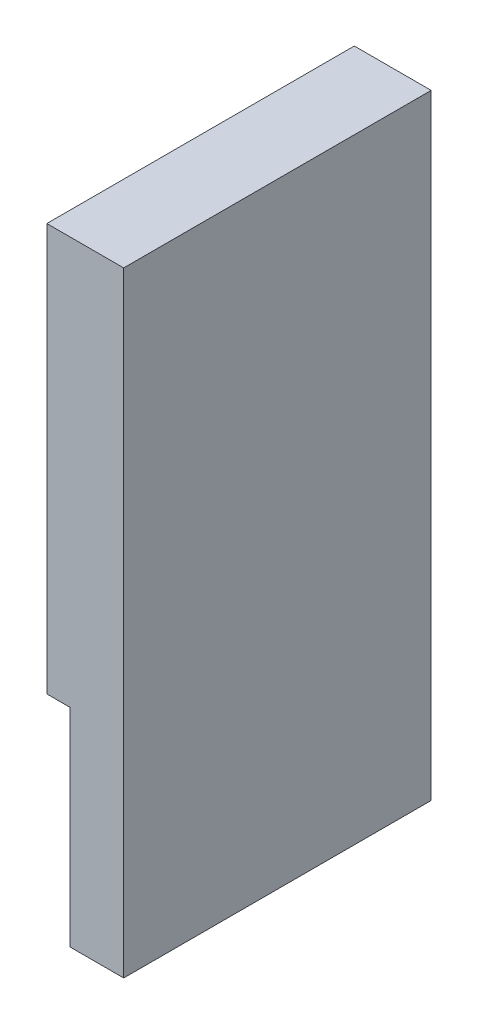
ISO-10303-21;
HEADER;
FILE_DESCRIPTION(('STEP AP214'),'2;1');
FILE_NAME('part.step','',(''),(''),'','','');
FILE_SCHEMA(('AUTOMOTIVE_DESIGN { 1 0 10303 214 1 1 1 1 }'));
ENDSEC;
DATA;
#1=APPLICATION_CONTEXT('core data for automotive mechanical design processes');
#2=APPLICATION_PROTOCOL_DEFINITION('international standard','automotive_design',2000,#1);
#3=PRODUCT_CONTEXT('',#1,'mechanical');
#4=PRODUCT('Part','Part','',(#3));
#5=PRODUCT_RELATED_PRODUCT_CATEGORY('part','',(#4));
#6=PRODUCT_DEFINITION_FORMATION('','',#4);
#7=PRODUCT_DEFINITION_CONTEXT('part definition',#1,'design');
#8=PRODUCT_DEFINITION('design','',#6,#7);
#9=PRODUCT_DEFINITION_SHAPE('','',#8);
#10=(LENGTH_UNIT() NAMED_UNIT(*) SI_UNIT(.MILLI.,.METRE.));
#11=(NAMED_UNIT(*) PLANE_ANGLE_UNIT() SI_UNIT($,.RADIAN.));
#12=(NAMED_UNIT(*) SI_UNIT($,.STERADIAN.) SOLID_ANGLE_UNIT());
#13=UNCERTAINTY_MEASURE_WITH_UNIT(LENGTH_MEASURE(1.E-05),#10,'distance_accuracy_value','');
#14=(GEOMETRIC_REPRESENTATION_CONTEXT(3) GLOBAL_UNCERTAINTY_ASSIGNED_CONTEXT((#13)) GLOBAL_UNIT_ASSIGNED_CONTEXT((#10,
#11,#12)) REPRESENTATION_CONTEXT('',''));
#15=CARTESIAN_POINT('',(0.,0.,0.));
#16=DIRECTION('',(0.,0.,1.));
#17=DIRECTION('',(1.,0.,0.));
#18=AXIS2_PLACEMENT_3D('',#15,#16,#17);
#19=CARTESIAN_POINT('',(10.,1.83908045977011,0.));
#20=DIRECTION('',(0.,1.,0.));
#21=DIRECTION('',(0.,0.,1.));
#22=AXIS2_PLACEMENT_3D('',#19,#20,#21);
#23=PLANE('',#22);
#24=DIRECTION('',(0.,0.,1.));
#25=VECTOR('',#24,1.);
#26=CARTESIAN_POINT('',(3.,1.83908045977011,-40.));
#27=LINE('',#26,#25);
#28=CARTESIAN_POINT('',(3.,1.83908045977011,-40.));
#29=VERTEX_POINT('',#28);
#30=CARTESIAN_POINT('',(3.,1.83908045977011,0.));
#31=VERTEX_POINT('',#30);
#32=EDGE_CURVE('E103',#29,#31,#27,.T.);
#33=ORIENTED_EDGE('',*,*,#32,.F.);
#34=DIRECTION('',(-1.,0.,0.));
#35=VECTOR('',#34,1.);
#36=CARTESIAN_POINT('',(10.,1.83908045977011,-40.));
#37=LINE('',#36,#35);
#38=CARTESIAN_POINT('',(10.,1.83908045977011,-40.));
#39=VERTEX_POINT('',#38);
#40=EDGE_CURVE('E45',#39,#29,#37,.T.);
#41=ORIENTED_EDGE('',*,*,#40,.F.);
#42=DIRECTION('',(0.,0.,-1.));
#43=VECTOR('',#42,1.);
#44=CARTESIAN_POINT('',(10.,1.83908045977011,0.));
#45=LINE('',#44,#43);
#46=CARTESIAN_POINT('',(10.,1.83908045977011,0.));
#47=VERTEX_POINT('',#46);
#48=EDGE_CURVE('E83',#47,#39,#45,.T.);
#49=ORIENTED_EDGE('',*,*,#48,.F.);
#50=DIRECTION('',(-1.,0.,0.));
#51=VECTOR('',#50,1.);
#52=CARTESIAN_POINT('',(10.,1.83908045977011,0.));
#53=LINE('',#52,#51);
#54=EDGE_CURVE('E11',#47,#31,#53,.T.);
#55=ORIENTED_EDGE('',*,*,#54,.T.);
#56=EDGE_LOOP('',(#33,#41,#49,#55));
#57=FACE_BOUND('',#56,.T.);
#58=ADVANCED_FACE('F37',(#57),#23,.F.);
#59=CARTESIAN_POINT('',(10.,81.8390804597701,0.));
#60=DIRECTION('',(0.,0.,-1.));
#61=DIRECTION('',(0.,1.,0.));
#62=AXIS2_PLACEMENT_3D('',#59,#60,#61);
#63=PLANE('',#62);
#64=DIRECTION('',(0.,-1.,0.));
#65=VECTOR('',#64,1.);
#66=CARTESIAN_POINT('',(0.,81.8390804597701,0.));
#67=LINE('',#66,#65);
#68=CARTESIAN_POINT('',(0.,81.8390804597701,0.));
#69=VERTEX_POINT('',#68);
#70=CARTESIAN_POINT('',(0.,28.8390804597701,0.));
#71=VERTEX_POINT('',#70);
#72=EDGE_CURVE('E127',#69,#71,#67,.T.);
#73=ORIENTED_EDGE('',*,*,#72,.T.);
#74=DIRECTION('',(-1.,0.,0.));
#75=VECTOR('',#74,1.);
#76=CARTESIAN_POINT('',(3.,28.8390804597701,0.));
#77=LINE('',#76,#75);
#78=CARTESIAN_POINT('',(3.,28.8390804597701,0.));
#79=VERTEX_POINT('',#78);
#80=EDGE_CURVE('E52',#79,#71,#77,.T.);
#81=ORIENTED_EDGE('',*,*,#80,.F.);
#82=DIRECTION('',(0.,1.,0.));
#83=VECTOR('',#82,1.);
#84=CARTESIAN_POINT('',(3.,28.8390804597701,0.));
#85=LINE('',#84,#83);
#86=EDGE_CURVE('E113',#31,#79,#85,.T.);
#87=ORIENTED_EDGE('',*,*,#86,.F.);
#88=ORIENTED_EDGE('',*,*,#54,.F.);
#89=DIRECTION('',(0.,-1.,0.));
#90=VECTOR('',#89,1.);
#91=CARTESIAN_POINT('',(10.,81.8390804597701,0.));
#92=LINE('',#91,#90);
#93=CARTESIAN_POINT('',(10.,81.8390804597701,0.));
#94=VERTEX_POINT('',#93);
#95=EDGE_CURVE('E124',#94,#47,#92,.T.);
#96=ORIENTED_EDGE('',*,*,#95,.F.);
#97=DIRECTION('',(-1.,0.,0.));
#98=VECTOR('',#97,1.);
#99=CARTESIAN_POINT('',(10.,81.8390804597701,0.));
#100=LINE('',#99,#98);
#101=EDGE_CURVE('E119',#94,#69,#100,.T.);
#102=ORIENTED_EDGE('',*,*,#101,.T.);
#103=EDGE_LOOP('',(#73,#81,#87,#88,#96,#102));
#104=FACE_BOUND('',#103,.T.);
#105=ADVANCED_FACE('F39',(#104),#63,.F.);
#106=CARTESIAN_POINT('',(10.,81.8390804597701,-40.));
#107=DIRECTION('',(0.,0.,1.));
#108=DIRECTION('',(1.,0.,0.));
#109=AXIS2_PLACEMENT_3D('',#106,#107,#108);
#110=PLANE('',#109);
#111=DIRECTION('',(0.,-1.,0.));
#112=VECTOR('',#111,1.);
#113=CARTESIAN_POINT('',(3.,28.8390804597701,-40.));
#114=LINE('',#113,#112);
#115=CARTESIAN_POINT('',(3.,28.8390804597701,-40.));
#116=VERTEX_POINT('',#115);
#117=EDGE_CURVE('E100',#116,#29,#114,.T.);
#118=ORIENTED_EDGE('',*,*,#117,.F.);
#119=DIRECTION('',(-1.,0.,0.));
#120=VECTOR('',#119,1.);
#121=CARTESIAN_POINT('',(3.,28.8390804597701,-40.));
#122=LINE('',#121,#120);
#123=CARTESIAN_POINT('',(0.,28.8390804597701,-40.));
#124=VERTEX_POINT('',#123);
#125=EDGE_CURVE('E130',#116,#124,#122,.T.);
#126=ORIENTED_EDGE('',*,*,#125,.T.);
#127=DIRECTION('',(0.,1.,0.));
#128=VECTOR('',#127,1.);
#129=CARTESIAN_POINT('',(0.,81.8390804597701,-40.));
#130=LINE('',#129,#128);
#131=CARTESIAN_POINT('',(0.,81.8390804597701,-40.));
#132=VERTEX_POINT('',#131);
#133=EDGE_CURVE('E125',#124,#132,#130,.T.);
#134=ORIENTED_EDGE('',*,*,#133,.T.);
#135=DIRECTION('',(-1.,0.,0.));
#136=VECTOR('',#135,1.);
#137=CARTESIAN_POINT('',(10.,81.8390804597701,-40.));
#138=LINE('',#137,#136);
#139=CARTESIAN_POINT('',(10.,81.8390804597701,-40.));
#140=VERTEX_POINT('',#139);
#141=EDGE_CURVE('E118',#140,#132,#138,.T.);
#142=ORIENTED_EDGE('',*,*,#141,.F.);
#143=DIRECTION('',(0.,1.,0.));
#144=VECTOR('',#143,1.);
#145=CARTESIAN_POINT('',(10.,81.8390804597701,-40.));
#146=LINE('',#145,#144);
#147=EDGE_CURVE('E117',#39,#140,#146,.T.);
#148=ORIENTED_EDGE('',*,*,#147,.F.);
#149=ORIENTED_EDGE('',*,*,#40,.T.);
#150=EDGE_LOOP('',(#118,#126,#134,#142,#148,#149));
#151=FACE_BOUND('',#150,.T.);
#152=ADVANCED_FACE('F115',(#151),#110,.F.);
#153=CARTESIAN_POINT('',(10.,81.8390804597701,0.));
#154=DIRECTION('',(0.,-1.,0.));
#155=DIRECTION('',(0.,0.,-1.));
#156=AXIS2_PLACEMENT_3D('',#153,#154,#155);
#157=PLANE('',#156);
#158=DIRECTION('',(0.,0.,1.));
#159=VECTOR('',#158,1.);
#160=CARTESIAN_POINT('',(0.,81.8390804597701,0.));
#161=LINE('',#160,#159);
#162=EDGE_CURVE('E76',#132,#69,#161,.T.);
#163=ORIENTED_EDGE('',*,*,#162,.T.);
#164=ORIENTED_EDGE('',*,*,#101,.F.);
#165=DIRECTION('',(0.,0.,1.));
#166=VECTOR('',#165,1.);
#167=CARTESIAN_POINT('',(10.,81.8390804597701,0.));
#168=LINE('',#167,#166);
#169=EDGE_CURVE('E61',#140,#94,#168,.T.);
#170=ORIENTED_EDGE('',*,*,#169,.F.);
#171=ORIENTED_EDGE('',*,*,#141,.T.);
#172=EDGE_LOOP('',(#163,#164,#170,#171));
#173=FACE_BOUND('',#172,.T.);
#174=ADVANCED_FACE('F146',(#173),#157,.F.);
#175=CARTESIAN_POINT('',(10.,0.,0.));
#176=DIRECTION('',(1.,0.,0.));
#177=DIRECTION('',(0.,0.,-1.));
#178=AXIS2_PLACEMENT_3D('',#175,#176,#177);
#179=PLANE('',#178);
#180=ORIENTED_EDGE('',*,*,#95,.T.);
#181=ORIENTED_EDGE('',*,*,#48,.T.);
#182=ORIENTED_EDGE('',*,*,#147,.T.);
#183=ORIENTED_EDGE('',*,*,#169,.T.);
#184=EDGE_LOOP('',(#180,#181,#182,#183));
#185=FACE_BOUND('',#184,.T.);
#186=ADVANCED_FACE('F147',(#185),#179,.T.);
#187=CARTESIAN_POINT('',(0.,0.,0.));
#188=DIRECTION('',(1.,0.,0.));
#189=DIRECTION('',(0.,0.,-1.));
#190=AXIS2_PLACEMENT_3D('',#187,#188,#189);
#191=PLANE('',#190);
#192=ORIENTED_EDGE('',*,*,#133,.F.);
#193=DIRECTION('',(0.,0.,-1.));
#194=VECTOR('',#193,1.);
#195=CARTESIAN_POINT('',(0.,28.8390804597701,-40.));
#196=LINE('',#195,#194);
#197=EDGE_CURVE('E109',#71,#124,#196,.T.);
#198=ORIENTED_EDGE('',*,*,#197,.F.);
#199=ORIENTED_EDGE('',*,*,#72,.F.);
#200=ORIENTED_EDGE('',*,*,#162,.F.);
#201=EDGE_LOOP('',(#192,#198,#199,#200));
#202=FACE_BOUND('',#201,.T.);
#203=ADVANCED_FACE('F145',(#202),#191,.F.);
#204=CARTESIAN_POINT('',(3.,28.8390804597701,-40.));
#205=DIRECTION('',(0.,1.,0.));
#206=DIRECTION('',(0.,0.,1.));
#207=AXIS2_PLACEMENT_3D('',#204,#205,#206);
#208=PLANE('',#207);
#209=ORIENTED_EDGE('',*,*,#197,.T.);
#210=ORIENTED_EDGE('',*,*,#125,.F.);
#211=DIRECTION('',(0.,0.,-1.));
#212=VECTOR('',#211,1.);
#213=CARTESIAN_POINT('',(3.,28.8390804597701,-40.));
#214=LINE('',#213,#212);
#215=EDGE_CURVE('E105',#79,#116,#214,.T.);
#216=ORIENTED_EDGE('',*,*,#215,.F.);
#217=ORIENTED_EDGE('',*,*,#80,.T.);
#218=EDGE_LOOP('',(#209,#210,#216,#217));
#219=FACE_BOUND('',#218,.T.);
#220=ADVANCED_FACE('F140',(#219),#208,.F.);
#221=CARTESIAN_POINT('',(3.,0.,0.));
#222=DIRECTION('',(-1.,0.,0.));
#223=DIRECTION('',(0.,0.,1.));
#224=AXIS2_PLACEMENT_3D('',#221,#222,#223);
#225=PLANE('',#224);
#226=ORIENTED_EDGE('',*,*,#117,.T.);
#227=ORIENTED_EDGE('',*,*,#32,.T.);
#228=ORIENTED_EDGE('',*,*,#86,.T.);
#229=ORIENTED_EDGE('',*,*,#215,.T.);
#230=EDGE_LOOP('',(#226,#227,#228,#229));
#231=FACE_BOUND('',#230,.T.);
#232=ADVANCED_FACE('F102',(#231),#225,.T.);
#233=CLOSED_SHELL('',(#58,#105,#152,#174,#186,#203,#220,#232));
#234=MANIFOLD_SOLID_BREP('B2',#233);
#235=ADVANCED_BREP_SHAPE_REPRESENTATION('',(#18,#234),#14);
#236=SHAPE_DEFINITION_REPRESENTATION(#9,#235);
ENDSEC;
END-ISO-10303-21;
